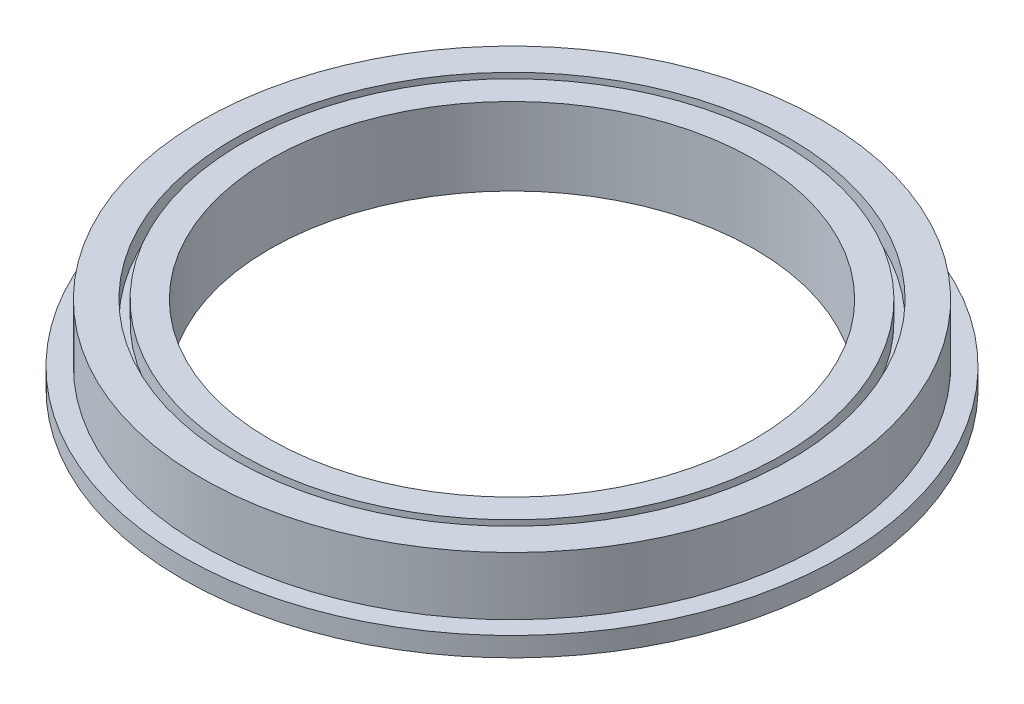
ISO-10303-21;
HEADER;
FILE_DESCRIPTION(('STEP AP214'),'2;1');
FILE_NAME('part.step','',(''),(''),'','','');
FILE_SCHEMA(('AUTOMOTIVE_DESIGN { 1 0 10303 214 1 1 1 1 }'));
ENDSEC;
DATA;
#1=APPLICATION_CONTEXT('core data for automotive mechanical design processes');
#2=APPLICATION_PROTOCOL_DEFINITION('international standard','automotive_design',2000,#1);
#3=PRODUCT_CONTEXT('',#1,'mechanical');
#4=PRODUCT('Part','Part','',(#3));
#5=PRODUCT_RELATED_PRODUCT_CATEGORY('part','',(#4));
#6=PRODUCT_DEFINITION_FORMATION('','',#4);
#7=PRODUCT_DEFINITION_CONTEXT('part definition',#1,'design');
#8=PRODUCT_DEFINITION('design','',#6,#7);
#9=PRODUCT_DEFINITION_SHAPE('','',#8);
#10=(LENGTH_UNIT() NAMED_UNIT(*) SI_UNIT(.MILLI.,.METRE.));
#11=(NAMED_UNIT(*) PLANE_ANGLE_UNIT() SI_UNIT($,.RADIAN.));
#12=(NAMED_UNIT(*) SI_UNIT($,.STERADIAN.) SOLID_ANGLE_UNIT());
#13=UNCERTAINTY_MEASURE_WITH_UNIT(LENGTH_MEASURE(1.E-05),#10,'distance_accuracy_value','');
#14=(GEOMETRIC_REPRESENTATION_CONTEXT(3) GLOBAL_UNCERTAINTY_ASSIGNED_CONTEXT((#13)) GLOBAL_UNIT_ASSIGNED_CONTEXT((#10,
#11,#12)) REPRESENTATION_CONTEXT('',''));
#15=CARTESIAN_POINT('',(0.,0.,0.));
#16=DIRECTION('',(0.,0.,1.));
#17=DIRECTION('',(1.,0.,0.));
#18=AXIS2_PLACEMENT_3D('',#15,#16,#17);
#19=CARTESIAN_POINT('',(16.,3.,0.));
#20=DIRECTION('',(0.,1.,0.));
#21=DIRECTION('',(0.,0.,1.));
#22=AXIS2_PLACEMENT_3D('',#19,#20,#21);
#23=PLANE('',#22);
#24=CARTESIAN_POINT('',(0.,3.,0.));
#25=DIRECTION('',(0.,-1.,0.));
#26=DIRECTION('',(0.,0.,-1.));
#27=AXIS2_PLACEMENT_3D('',#24,#25,#26);
#28=CIRCLE('',#27,12.5);
#29=CARTESIAN_POINT('',(0.,3.,-12.5));
#30=VERTEX_POINT('',#29);
#31=EDGE_CURVE('E10',#30,#30,#28,.T.);
#32=ORIENTED_EDGE('',*,*,#31,.T.);
#33=EDGE_LOOP('',(#32));
#34=FACE_BOUND('',#33,.T.);
#35=CARTESIAN_POINT('',(0.,3.,0.));
#36=DIRECTION('',(0.,1.,0.));
#37=DIRECTION('',(0.,0.,1.));
#38=AXIS2_PLACEMENT_3D('',#35,#36,#37);
#39=CIRCLE('',#38,13.9323121502697);
#40=CARTESIAN_POINT('',(0.,3.,13.9323121502697));
#41=VERTEX_POINT('',#40);
#42=EDGE_CURVE('E82',#41,#41,#39,.T.);
#43=ORIENTED_EDGE('',*,*,#42,.T.);
#44=EDGE_LOOP('',(#43));
#45=FACE_BOUND('',#44,.T.);
#46=ADVANCED_FACE('F41',(#34,#45),#23,.T.);
#47=CARTESIAN_POINT('',(0.,3.,0.));
#48=DIRECTION('',(0.,1.,0.));
#49=DIRECTION('',(0.,0.,1.));
#50=AXIS2_PLACEMENT_3D('',#47,#48,#49);
#51=CIRCLE('',#50,14.3403569030838);
#52=CARTESIAN_POINT('',(0.,3.,14.3403569030838));
#53=VERTEX_POINT('',#52);
#54=EDGE_CURVE('E74',#53,#53,#51,.T.);
#55=ORIENTED_EDGE('',*,*,#54,.F.);
#56=EDGE_LOOP('',(#55));
#57=FACE_BOUND('',#56,.T.);
#58=CARTESIAN_POINT('',(0.,3.,0.));
#59=DIRECTION('',(0.,-1.,0.));
#60=DIRECTION('',(0.,0.,-1.));
#61=AXIS2_PLACEMENT_3D('',#58,#59,#60);
#62=CIRCLE('',#61,16.);
#63=CARTESIAN_POINT('',(0.,3.,-16.));
#64=VERTEX_POINT('',#63);
#65=EDGE_CURVE('E54',#64,#64,#62,.T.);
#66=ORIENTED_EDGE('',*,*,#65,.F.);
#67=EDGE_LOOP('',(#66));
#68=FACE_BOUND('',#67,.T.);
#69=ADVANCED_FACE('F43',(#57,#68),#23,.T.);
#70=CARTESIAN_POINT('',(0.,0.,0.));
#71=DIRECTION('',(0.,-1.,0.));
#72=DIRECTION('',(0.,0.,-1.));
#73=AXIS2_PLACEMENT_3D('',#70,#71,#72);
#74=CYLINDRICAL_SURFACE('',#73,12.5);
#75=ORIENTED_EDGE('',*,*,#31,.F.);
#76=EDGE_LOOP('',(#75));
#77=FACE_BOUND('',#76,.T.);
#78=CARTESIAN_POINT('',(0.,-1.,0.));
#79=DIRECTION('',(0.,-1.,0.));
#80=DIRECTION('',(0.,0.,-1.));
#81=AXIS2_PLACEMENT_3D('',#78,#79,#80);
#82=CIRCLE('',#81,12.5);
#83=CARTESIAN_POINT('',(0.,-1.,-12.5));
#84=VERTEX_POINT('',#83);
#85=EDGE_CURVE('E66',#84,#84,#82,.T.);
#86=ORIENTED_EDGE('',*,*,#85,.T.);
#87=EDGE_LOOP('',(#86));
#88=FACE_BOUND('',#87,.T.);
#89=ADVANCED_FACE('F108',(#77,#88),#74,.F.);
#90=CARTESIAN_POINT('',(0.,0.,0.));
#91=DIRECTION('',(0.,-1.,0.));
#92=DIRECTION('',(0.,0.,-1.));
#93=AXIS2_PLACEMENT_3D('',#90,#91,#92);
#94=CYLINDRICAL_SURFACE('',#93,16.);
#95=ORIENTED_EDGE('',*,*,#65,.T.);
#96=EDGE_LOOP('',(#95));
#97=FACE_BOUND('',#96,.T.);
#98=CARTESIAN_POINT('',(0.,0.,0.));
#99=DIRECTION('',(0.,-1.,0.));
#100=DIRECTION('',(0.,0.,-1.));
#101=AXIS2_PLACEMENT_3D('',#98,#99,#100);
#102=CIRCLE('',#101,16.);
#103=CARTESIAN_POINT('',(0.,0.,-16.));
#104=VERTEX_POINT('',#103);
#105=EDGE_CURVE('E49',#104,#104,#102,.T.);
#106=ORIENTED_EDGE('',*,*,#105,.F.);
#107=EDGE_LOOP('',(#106));
#108=FACE_BOUND('',#107,.T.);
#109=ADVANCED_FACE('F111',(#97,#108),#94,.T.);
#110=CARTESIAN_POINT('',(0.,-1.,0.));
#111=DIRECTION('',(0.,-1.,0.));
#112=DIRECTION('',(0.,0.,-1.));
#113=AXIS2_PLACEMENT_3D('',#110,#111,#112);
#114=PLANE('',#113);
#115=CARTESIAN_POINT('',(0.,-1.,0.));
#116=DIRECTION('',(0.,-1.,0.));
#117=DIRECTION('',(0.,0.,-1.));
#118=AXIS2_PLACEMENT_3D('',#115,#116,#117);
#119=CIRCLE('',#118,17.);
#120=CARTESIAN_POINT('',(0.,-1.,-17.));
#121=VERTEX_POINT('',#120);
#122=EDGE_CURVE('E59',#121,#121,#119,.T.);
#123=ORIENTED_EDGE('',*,*,#122,.T.);
#124=EDGE_LOOP('',(#123));
#125=FACE_BOUND('',#124,.T.);
#126=ORIENTED_EDGE('',*,*,#85,.F.);
#127=EDGE_LOOP('',(#126));
#128=FACE_BOUND('',#127,.T.);
#129=ADVANCED_FACE('F114',(#125,#128),#114,.T.);
#130=CARTESIAN_POINT('',(0.,0.,0.));
#131=DIRECTION('',(0.,-1.,0.));
#132=DIRECTION('',(0.,0.,-1.));
#133=AXIS2_PLACEMENT_3D('',#130,#131,#132);
#134=PLANE('',#133);
#135=ORIENTED_EDGE('',*,*,#105,.T.);
#136=EDGE_LOOP('',(#135));
#137=FACE_BOUND('',#136,.T.);
#138=CARTESIAN_POINT('',(0.,0.,0.));
#139=DIRECTION('',(0.,-1.,0.));
#140=DIRECTION('',(0.,0.,-1.));
#141=AXIS2_PLACEMENT_3D('',#138,#139,#140);
#142=CIRCLE('',#141,17.);
#143=CARTESIAN_POINT('',(0.,0.,-17.));
#144=VERTEX_POINT('',#143);
#145=EDGE_CURVE('E62',#144,#144,#142,.T.);
#146=ORIENTED_EDGE('',*,*,#145,.F.);
#147=EDGE_LOOP('',(#146));
#148=FACE_BOUND('',#147,.T.);
#149=ADVANCED_FACE('F120',(#137,#148),#134,.F.);
#150=CARTESIAN_POINT('',(0.,-1.,0.));
#151=DIRECTION('',(0.,1.,0.));
#152=DIRECTION('',(0.,0.,1.));
#153=AXIS2_PLACEMENT_3D('',#150,#151,#152);
#154=CYLINDRICAL_SURFACE('',#153,17.);
#155=ORIENTED_EDGE('',*,*,#122,.F.);
#156=EDGE_LOOP('',(#155));
#157=FACE_BOUND('',#156,.T.);
#158=ORIENTED_EDGE('',*,*,#145,.T.);
#159=EDGE_LOOP('',(#158));
#160=FACE_BOUND('',#159,.T.);
#161=ADVANCED_FACE('F102',(#157,#160),#154,.T.);
#162=CARTESIAN_POINT('',(0.,2.,0.));
#163=DIRECTION('',(0.,1.,0.));
#164=DIRECTION('',(0.,0.,1.));
#165=AXIS2_PLACEMENT_3D('',#162,#163,#164);
#166=CYLINDRICAL_SURFACE('',#165,14.3403569030838);
#167=CARTESIAN_POINT('',(0.,2.,0.));
#168=DIRECTION('',(0.,1.,0.));
#169=DIRECTION('',(0.,0.,1.));
#170=AXIS2_PLACEMENT_3D('',#167,#168,#169);
#171=CIRCLE('',#170,14.3403569030838);
#172=CARTESIAN_POINT('',(0.,2.,14.3403569030838));
#173=VERTEX_POINT('',#172);
#174=EDGE_CURVE('E73',#173,#173,#171,.T.);
#175=ORIENTED_EDGE('',*,*,#174,.F.);
#176=EDGE_LOOP('',(#175));
#177=FACE_BOUND('',#176,.T.);
#178=ORIENTED_EDGE('',*,*,#54,.T.);
#179=EDGE_LOOP('',(#178));
#180=FACE_BOUND('',#179,.T.);
#181=ADVANCED_FACE('F96',(#177,#180),#166,.F.);
#182=CARTESIAN_POINT('',(0.,2.,0.));
#183=DIRECTION('',(0.,1.,0.));
#184=DIRECTION('',(0.,0.,1.));
#185=AXIS2_PLACEMENT_3D('',#182,#183,#184);
#186=PLANE('',#185);
#187=CARTESIAN_POINT('',(0.,2.,0.));
#188=DIRECTION('',(0.,1.,0.));
#189=DIRECTION('',(0.,0.,1.));
#190=AXIS2_PLACEMENT_3D('',#187,#188,#189);
#191=CIRCLE('',#190,13.9323121502697);
#192=CARTESIAN_POINT('',(0.,2.,13.9323121502697));
#193=VERTEX_POINT('',#192);
#194=EDGE_CURVE('E78',#193,#193,#191,.T.);
#195=ORIENTED_EDGE('',*,*,#194,.F.);
#196=EDGE_LOOP('',(#195));
#197=FACE_BOUND('',#196,.T.);
#198=ORIENTED_EDGE('',*,*,#174,.T.);
#199=EDGE_LOOP('',(#198));
#200=FACE_BOUND('',#199,.T.);
#201=ADVANCED_FACE('F93',(#197,#200),#186,.T.);
#202=CARTESIAN_POINT('',(0.,2.,0.));
#203=DIRECTION('',(0.,1.,0.));
#204=DIRECTION('',(0.,0.,1.));
#205=AXIS2_PLACEMENT_3D('',#202,#203,#204);
#206=CYLINDRICAL_SURFACE('',#205,13.9323121502697);
#207=ORIENTED_EDGE('',*,*,#194,.T.);
#208=EDGE_LOOP('',(#207));
#209=FACE_BOUND('',#208,.T.);
#210=ORIENTED_EDGE('',*,*,#42,.F.);
#211=EDGE_LOOP('',(#210));
#212=FACE_BOUND('',#211,.T.);
#213=ADVANCED_FACE('F90',(#209,#212),#206,.T.);
#214=CLOSED_SHELL('',(#46,#69,#89,#109,#129,#149,#161,#181,#201,#213));
#215=MANIFOLD_SOLID_BREP('B2',#214);
#216=ADVANCED_BREP_SHAPE_REPRESENTATION('',(#18,#215),#14);
#217=SHAPE_DEFINITION_REPRESENTATION(#9,#216);
ENDSEC;
END-ISO-10303-21;
